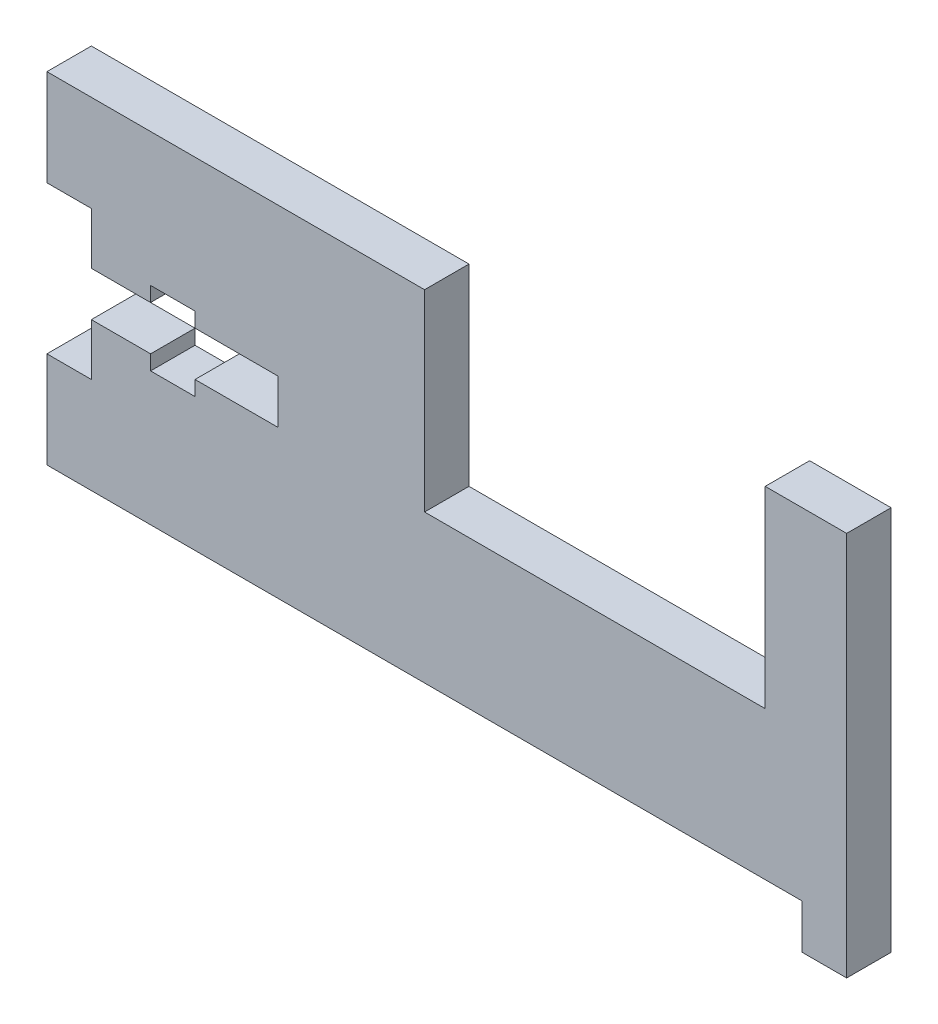
ISO-10303-21;
HEADER;
FILE_DESCRIPTION(('STEP AP214'),'2;1');
FILE_NAME('part.step','',(''),(''),'','','');
FILE_SCHEMA(('AUTOMOTIVE_DESIGN { 1 0 10303 214 1 1 1 1 }'));
ENDSEC;
DATA;
#1=APPLICATION_CONTEXT('core data for automotive mechanical design processes');
#2=APPLICATION_PROTOCOL_DEFINITION('international standard','automotive_design',2000,#1);
#3=PRODUCT_CONTEXT('',#1,'mechanical');
#4=PRODUCT('Part','Part','',(#3));
#5=PRODUCT_RELATED_PRODUCT_CATEGORY('part','',(#4));
#6=PRODUCT_DEFINITION_FORMATION('','',#4);
#7=PRODUCT_DEFINITION_CONTEXT('part definition',#1,'design');
#8=PRODUCT_DEFINITION('design','',#6,#7);
#9=PRODUCT_DEFINITION_SHAPE('','',#8);
#10=(LENGTH_UNIT() NAMED_UNIT(*) SI_UNIT(.MILLI.,.METRE.));
#11=(NAMED_UNIT(*) PLANE_ANGLE_UNIT() SI_UNIT($,.RADIAN.));
#12=(NAMED_UNIT(*) SI_UNIT($,.STERADIAN.) SOLID_ANGLE_UNIT());
#13=UNCERTAINTY_MEASURE_WITH_UNIT(LENGTH_MEASURE(1.E-05),#10,'distance_accuracy_value','');
#14=(GEOMETRIC_REPRESENTATION_CONTEXT(3) GLOBAL_UNCERTAINTY_ASSIGNED_CONTEXT((#13)) GLOBAL_UNIT_ASSIGNED_CONTEXT((#10,
#11,#12)) REPRESENTATION_CONTEXT('',''));
#15=CARTESIAN_POINT('',(0.,0.,0.));
#16=DIRECTION('',(0.,0.,1.));
#17=DIRECTION('',(1.,0.,0.));
#18=AXIS2_PLACEMENT_3D('',#15,#16,#17);
#19=CARTESIAN_POINT('',(-5.49999999999999,0.,3.));
#20=DIRECTION('',(0.,-1.,0.));
#21=DIRECTION('',(0.,0.,-1.));
#22=AXIS2_PLACEMENT_3D('',#19,#20,#21);
#23=PLANE('',#22);
#24=DIRECTION('',(-1.,0.,0.));
#25=VECTOR('',#24,1.);
#26=CARTESIAN_POINT('',(-5.49999999999999,0.,0.));
#27=LINE('',#26,#25);
#28=CARTESIAN_POINT('',(0.,0.,0.));
#29=VERTEX_POINT('',#28);
#30=CARTESIAN_POINT('',(-5.49999999999999,0.,0.));
#31=VERTEX_POINT('',#30);
#32=EDGE_CURVE('E243',#29,#31,#27,.T.);
#33=ORIENTED_EDGE('',*,*,#32,.T.);
#34=DIRECTION('',(0.,0.,-1.));
#35=VECTOR('',#34,1.);
#36=CARTESIAN_POINT('',(-5.49999999999999,0.,3.));
#37=LINE('',#36,#35);
#38=CARTESIAN_POINT('',(-5.49999999999999,0.,3.));
#39=VERTEX_POINT('',#38);
#40=EDGE_CURVE('E11',#39,#31,#37,.T.);
#41=ORIENTED_EDGE('',*,*,#40,.F.);
#42=DIRECTION('',(-1.,0.,0.));
#43=VECTOR('',#42,1.);
#44=CARTESIAN_POINT('',(-5.49999999999999,0.,3.));
#45=LINE('',#44,#43);
#46=CARTESIAN_POINT('',(0.,0.,3.));
#47=VERTEX_POINT('',#46);
#48=EDGE_CURVE('E293',#47,#39,#45,.T.);
#49=ORIENTED_EDGE('',*,*,#48,.F.);
#50=DIRECTION('',(0.,0.,-1.));
#51=VECTOR('',#50,1.);
#52=CARTESIAN_POINT('',(0.,0.,3.));
#53=LINE('',#52,#51);
#54=EDGE_CURVE('E239',#47,#29,#53,.T.);
#55=ORIENTED_EDGE('',*,*,#54,.T.);
#56=EDGE_LOOP('',(#33,#41,#49,#55));
#57=FACE_BOUND('',#56,.T.);
#58=ADVANCED_FACE('F39',(#57),#23,.F.);
#59=CARTESIAN_POINT('',(-5.49999999999999,-13.,3.));
#60=DIRECTION('',(1.,0.,0.));
#61=DIRECTION('',(0.,0.,-1.));
#62=AXIS2_PLACEMENT_3D('',#59,#60,#61);
#63=PLANE('',#62);
#64=DIRECTION('',(0.,-1.,0.));
#65=VECTOR('',#64,1.);
#66=CARTESIAN_POINT('',(-5.49999999999999,-13.,0.));
#67=LINE('',#66,#65);
#68=CARTESIAN_POINT('',(-5.49999999999999,-13.,0.));
#69=VERTEX_POINT('',#68);
#70=EDGE_CURVE('E246',#31,#69,#67,.T.);
#71=ORIENTED_EDGE('',*,*,#70,.T.);
#72=DIRECTION('',(0.,0.,-1.));
#73=VECTOR('',#72,1.);
#74=CARTESIAN_POINT('',(-5.49999999999999,-13.,3.));
#75=LINE('',#74,#73);
#76=CARTESIAN_POINT('',(-5.49999999999999,-13.,3.));
#77=VERTEX_POINT('',#76);
#78=EDGE_CURVE('E47',#77,#69,#75,.T.);
#79=ORIENTED_EDGE('',*,*,#78,.F.);
#80=DIRECTION('',(0.,-1.,0.));
#81=VECTOR('',#80,1.);
#82=CARTESIAN_POINT('',(-5.49999999999999,-13.,3.));
#83=LINE('',#82,#81);
#84=EDGE_CURVE('E152',#39,#77,#83,.T.);
#85=ORIENTED_EDGE('',*,*,#84,.F.);
#86=ORIENTED_EDGE('',*,*,#40,.T.);
#87=EDGE_LOOP('',(#71,#79,#85,#86));
#88=FACE_BOUND('',#87,.T.);
#89=ADVANCED_FACE('F441',(#88),#63,.F.);
#90=CARTESIAN_POINT('',(-28.5,-13.,3.));
#91=DIRECTION('',(0.,-1.,0.));
#92=DIRECTION('',(0.,0.,-1.));
#93=AXIS2_PLACEMENT_3D('',#90,#91,#92);
#94=PLANE('',#93);
#95=DIRECTION('',(-1.,0.,0.));
#96=VECTOR('',#95,1.);
#97=CARTESIAN_POINT('',(-28.5,-13.,0.));
#98=LINE('',#97,#96);
#99=CARTESIAN_POINT('',(-28.5,-13.,0.));
#100=VERTEX_POINT('',#99);
#101=EDGE_CURVE('E248',#69,#100,#98,.T.);
#102=ORIENTED_EDGE('',*,*,#101,.T.);
#103=DIRECTION('',(0.,0.,-1.));
#104=VECTOR('',#103,1.);
#105=CARTESIAN_POINT('',(-28.5,-13.,3.));
#106=LINE('',#105,#104);
#107=CARTESIAN_POINT('',(-28.5,-13.,3.));
#108=VERTEX_POINT('',#107);
#109=EDGE_CURVE('E354',#108,#100,#106,.T.);
#110=ORIENTED_EDGE('',*,*,#109,.F.);
#111=DIRECTION('',(-1.,0.,0.));
#112=VECTOR('',#111,1.);
#113=CARTESIAN_POINT('',(-28.5,-13.,3.));
#114=LINE('',#113,#112);
#115=EDGE_CURVE('E362',#77,#108,#114,.T.);
#116=ORIENTED_EDGE('',*,*,#115,.F.);
#117=ORIENTED_EDGE('',*,*,#78,.T.);
#118=EDGE_LOOP('',(#102,#110,#116,#117));
#119=FACE_BOUND('',#118,.T.);
#120=ADVANCED_FACE('F360',(#119),#94,.F.);
#121=CARTESIAN_POINT('',(-28.5,0.,3.));
#122=DIRECTION('',(-1.,0.,0.));
#123=DIRECTION('',(0.,0.,1.));
#124=AXIS2_PLACEMENT_3D('',#121,#122,#123);
#125=PLANE('',#124);
#126=DIRECTION('',(0.,1.,0.));
#127=VECTOR('',#126,1.);
#128=CARTESIAN_POINT('',(-28.5,0.,0.));
#129=LINE('',#128,#127);
#130=CARTESIAN_POINT('',(-28.5,0.,0.));
#131=VERTEX_POINT('',#130);
#132=EDGE_CURVE('E250',#100,#131,#129,.T.);
#133=ORIENTED_EDGE('',*,*,#132,.T.);
#134=DIRECTION('',(0.,0.,-1.));
#135=VECTOR('',#134,1.);
#136=CARTESIAN_POINT('',(-28.5,0.,3.));
#137=LINE('',#136,#135);
#138=CARTESIAN_POINT('',(-28.5,0.,3.));
#139=VERTEX_POINT('',#138);
#140=EDGE_CURVE('E351',#139,#131,#137,.T.);
#141=ORIENTED_EDGE('',*,*,#140,.F.);
#142=DIRECTION('',(0.,1.,0.));
#143=VECTOR('',#142,1.);
#144=CARTESIAN_POINT('',(-28.5,0.,3.));
#145=LINE('',#144,#143);
#146=EDGE_CURVE('E380',#108,#139,#145,.T.);
#147=ORIENTED_EDGE('',*,*,#146,.F.);
#148=ORIENTED_EDGE('',*,*,#109,.T.);
#149=EDGE_LOOP('',(#133,#141,#147,#148));
#150=FACE_BOUND('',#149,.T.);
#151=ADVANCED_FACE('F371',(#150),#125,.F.);
#152=CARTESIAN_POINT('',(-54.,0.,3.));
#153=DIRECTION('',(0.,-1.,0.));
#154=DIRECTION('',(0.,0.,-1.));
#155=AXIS2_PLACEMENT_3D('',#152,#153,#154);
#156=PLANE('',#155);
#157=DIRECTION('',(-1.,0.,0.));
#158=VECTOR('',#157,1.);
#159=CARTESIAN_POINT('',(-54.,0.,0.));
#160=LINE('',#159,#158);
#161=CARTESIAN_POINT('',(-54.,0.,0.));
#162=VERTEX_POINT('',#161);
#163=EDGE_CURVE('E252',#131,#162,#160,.T.);
#164=ORIENTED_EDGE('',*,*,#163,.T.);
#165=DIRECTION('',(0.,0.,-1.));
#166=VECTOR('',#165,1.);
#167=CARTESIAN_POINT('',(-54.,0.,3.));
#168=LINE('',#167,#166);
#169=CARTESIAN_POINT('',(-54.,0.,3.));
#170=VERTEX_POINT('',#169);
#171=EDGE_CURVE('E348',#170,#162,#168,.T.);
#172=ORIENTED_EDGE('',*,*,#171,.F.);
#173=DIRECTION('',(-1.,0.,0.));
#174=VECTOR('',#173,1.);
#175=CARTESIAN_POINT('',(-54.,0.,3.));
#176=LINE('',#175,#174);
#177=EDGE_CURVE('E377',#139,#170,#176,.T.);
#178=ORIENTED_EDGE('',*,*,#177,.F.);
#179=ORIENTED_EDGE('',*,*,#140,.T.);
#180=EDGE_LOOP('',(#164,#172,#178,#179));
#181=FACE_BOUND('',#180,.T.);
#182=ADVANCED_FACE('F375',(#181),#156,.F.);
#183=CARTESIAN_POINT('',(-54.,-6.5,3.));
#184=DIRECTION('',(1.,0.,0.));
#185=DIRECTION('',(0.,0.,-1.));
#186=AXIS2_PLACEMENT_3D('',#183,#184,#185);
#187=PLANE('',#186);
#188=DIRECTION('',(0.,-1.,0.));
#189=VECTOR('',#188,1.);
#190=CARTESIAN_POINT('',(-54.,-6.5,0.));
#191=LINE('',#190,#189);
#192=CARTESIAN_POINT('',(-54.,-6.5,0.));
#193=VERTEX_POINT('',#192);
#194=EDGE_CURVE('E254',#162,#193,#191,.T.);
#195=ORIENTED_EDGE('',*,*,#194,.T.);
#196=DIRECTION('',(0.,0.,-1.));
#197=VECTOR('',#196,1.);
#198=CARTESIAN_POINT('',(-54.,-6.5,3.));
#199=LINE('',#198,#197);
#200=CARTESIAN_POINT('',(-54.,-6.5,3.));
#201=VERTEX_POINT('',#200);
#202=EDGE_CURVE('E345',#201,#193,#199,.T.);
#203=ORIENTED_EDGE('',*,*,#202,.F.);
#204=DIRECTION('',(0.,-1.,0.));
#205=VECTOR('',#204,1.);
#206=CARTESIAN_POINT('',(-54.,-6.5,3.));
#207=LINE('',#206,#205);
#208=EDGE_CURVE('E379',#170,#201,#207,.T.);
#209=ORIENTED_EDGE('',*,*,#208,.F.);
#210=ORIENTED_EDGE('',*,*,#171,.T.);
#211=EDGE_LOOP('',(#195,#203,#209,#210));
#212=FACE_BOUND('',#211,.T.);
#213=ADVANCED_FACE('F454',(#212),#187,.F.);
#214=CARTESIAN_POINT('',(-51.,-6.5,3.));
#215=DIRECTION('',(0.,1.,0.));
#216=DIRECTION('',(0.,0.,1.));
#217=AXIS2_PLACEMENT_3D('',#214,#215,#216);
#218=PLANE('',#217);
#219=DIRECTION('',(1.,0.,0.));
#220=VECTOR('',#219,1.);
#221=CARTESIAN_POINT('',(-51.,-6.5,0.));
#222=LINE('',#221,#220);
#223=CARTESIAN_POINT('',(-51.,-6.5,0.));
#224=VERTEX_POINT('',#223);
#225=EDGE_CURVE('E256',#193,#224,#222,.T.);
#226=ORIENTED_EDGE('',*,*,#225,.T.);
#227=DIRECTION('',(0.,0.,-1.));
#228=VECTOR('',#227,1.);
#229=CARTESIAN_POINT('',(-51.,-6.5,3.));
#230=LINE('',#229,#228);
#231=CARTESIAN_POINT('',(-51.,-6.5,3.));
#232=VERTEX_POINT('',#231);
#233=EDGE_CURVE('E342',#232,#224,#230,.T.);
#234=ORIENTED_EDGE('',*,*,#233,.F.);
#235=DIRECTION('',(1.,0.,0.));
#236=VECTOR('',#235,1.);
#237=CARTESIAN_POINT('',(-51.,-6.5,3.));
#238=LINE('',#237,#236);
#239=EDGE_CURVE('E382',#201,#232,#238,.T.);
#240=ORIENTED_EDGE('',*,*,#239,.F.);
#241=ORIENTED_EDGE('',*,*,#202,.T.);
#242=EDGE_LOOP('',(#226,#234,#240,#241));
#243=FACE_BOUND('',#242,.T.);
#244=ADVANCED_FACE('F457',(#243),#218,.F.);
#245=CARTESIAN_POINT('',(-51.,-9.99999999999999,3.));
#246=DIRECTION('',(1.,0.,0.));
#247=DIRECTION('',(0.,0.,-1.));
#248=AXIS2_PLACEMENT_3D('',#245,#246,#247);
#249=PLANE('',#248);
#250=DIRECTION('',(0.,-1.,0.));
#251=VECTOR('',#250,1.);
#252=CARTESIAN_POINT('',(-51.,-9.99999999999999,0.));
#253=LINE('',#252,#251);
#254=CARTESIAN_POINT('',(-51.,-9.99999999999999,0.));
#255=VERTEX_POINT('',#254);
#256=EDGE_CURVE('E258',#224,#255,#253,.T.);
#257=ORIENTED_EDGE('',*,*,#256,.T.);
#258=DIRECTION('',(0.,0.,-1.));
#259=VECTOR('',#258,1.);
#260=CARTESIAN_POINT('',(-51.,-9.99999999999999,3.));
#261=LINE('',#260,#259);
#262=CARTESIAN_POINT('',(-51.,-9.99999999999999,3.));
#263=VERTEX_POINT('',#262);
#264=EDGE_CURVE('E339',#263,#255,#261,.T.);
#265=ORIENTED_EDGE('',*,*,#264,.F.);
#266=DIRECTION('',(0.,-1.,0.));
#267=VECTOR('',#266,1.);
#268=CARTESIAN_POINT('',(-51.,-9.99999999999999,3.));
#269=LINE('',#268,#267);
#270=EDGE_CURVE('E388',#232,#263,#269,.T.);
#271=ORIENTED_EDGE('',*,*,#270,.F.);
#272=ORIENTED_EDGE('',*,*,#233,.T.);
#273=EDGE_LOOP('',(#257,#265,#271,#272));
#274=FACE_BOUND('',#273,.T.);
#275=ADVANCED_FACE('F461',(#274),#249,.F.);
#276=CARTESIAN_POINT('',(-47.,-9.99999999999999,3.));
#277=DIRECTION('',(0.,1.,0.));
#278=DIRECTION('',(0.,0.,1.));
#279=AXIS2_PLACEMENT_3D('',#276,#277,#278);
#280=PLANE('',#279);
#281=DIRECTION('',(1.,0.,0.));
#282=VECTOR('',#281,1.);
#283=CARTESIAN_POINT('',(-47.,-9.99999999999999,0.));
#284=LINE('',#283,#282);
#285=CARTESIAN_POINT('',(-47.,-9.99999999999999,0.));
#286=VERTEX_POINT('',#285);
#287=EDGE_CURVE('E260',#255,#286,#284,.T.);
#288=ORIENTED_EDGE('',*,*,#287,.T.);
#289=DIRECTION('',(0.,0.,-1.));
#290=VECTOR('',#289,1.);
#291=CARTESIAN_POINT('',(-47.,-9.99999999999999,3.));
#292=LINE('',#291,#290);
#293=CARTESIAN_POINT('',(-47.,-9.99999999999999,3.));
#294=VERTEX_POINT('',#293);
#295=EDGE_CURVE('E336',#294,#286,#292,.T.);
#296=ORIENTED_EDGE('',*,*,#295,.F.);
#297=DIRECTION('',(1.,0.,0.));
#298=VECTOR('',#297,1.);
#299=CARTESIAN_POINT('',(-47.,-9.99999999999999,3.));
#300=LINE('',#299,#298);
#301=EDGE_CURVE('E390',#263,#294,#300,.T.);
#302=ORIENTED_EDGE('',*,*,#301,.F.);
#303=ORIENTED_EDGE('',*,*,#264,.T.);
#304=EDGE_LOOP('',(#288,#296,#302,#303));
#305=FACE_BOUND('',#304,.T.);
#306=ADVANCED_FACE('F465',(#305),#280,.F.);
#307=CARTESIAN_POINT('',(-47.,-8.99999999999999,3.));
#308=DIRECTION('',(-1.,0.,0.));
#309=DIRECTION('',(0.,0.,1.));
#310=AXIS2_PLACEMENT_3D('',#307,#308,#309);
#311=PLANE('',#310);
#312=DIRECTION('',(0.,1.,0.));
#313=VECTOR('',#312,1.);
#314=CARTESIAN_POINT('',(-47.,-8.99999999999999,0.));
#315=LINE('',#314,#313);
#316=CARTESIAN_POINT('',(-47.,-8.99999999999999,0.));
#317=VERTEX_POINT('',#316);
#318=EDGE_CURVE('E262',#286,#317,#315,.T.);
#319=ORIENTED_EDGE('',*,*,#318,.T.);
#320=DIRECTION('',(0.,0.,-1.));
#321=VECTOR('',#320,1.);
#322=CARTESIAN_POINT('',(-47.,-8.99999999999999,3.));
#323=LINE('',#322,#321);
#324=CARTESIAN_POINT('',(-47.,-8.99999999999999,3.));
#325=VERTEX_POINT('',#324);
#326=EDGE_CURVE('E333',#325,#317,#323,.T.);
#327=ORIENTED_EDGE('',*,*,#326,.F.);
#328=DIRECTION('',(0.,1.,0.));
#329=VECTOR('',#328,1.);
#330=CARTESIAN_POINT('',(-47.,-8.99999999999999,3.));
#331=LINE('',#330,#329);
#332=EDGE_CURVE('E392',#294,#325,#331,.T.);
#333=ORIENTED_EDGE('',*,*,#332,.F.);
#334=ORIENTED_EDGE('',*,*,#295,.T.);
#335=EDGE_LOOP('',(#319,#327,#333,#334));
#336=FACE_BOUND('',#335,.T.);
#337=ADVANCED_FACE('F469',(#336),#311,.F.);
#338=CARTESIAN_POINT('',(-44.,-8.99999999999999,3.));
#339=DIRECTION('',(0.,1.,0.));
#340=DIRECTION('',(0.,0.,1.));
#341=AXIS2_PLACEMENT_3D('',#338,#339,#340);
#342=PLANE('',#341);
#343=DIRECTION('',(1.,0.,0.));
#344=VECTOR('',#343,1.);
#345=CARTESIAN_POINT('',(-44.,-8.99999999999999,0.));
#346=LINE('',#345,#344);
#347=CARTESIAN_POINT('',(-44.,-8.99999999999999,0.));
#348=VERTEX_POINT('',#347);
#349=EDGE_CURVE('E264',#317,#348,#346,.T.);
#350=ORIENTED_EDGE('',*,*,#349,.T.);
#351=DIRECTION('',(0.,0.,-1.));
#352=VECTOR('',#351,1.);
#353=CARTESIAN_POINT('',(-44.,-8.99999999999999,3.));
#354=LINE('',#353,#352);
#355=CARTESIAN_POINT('',(-44.,-8.99999999999999,3.));
#356=VERTEX_POINT('',#355);
#357=EDGE_CURVE('E330',#356,#348,#354,.T.);
#358=ORIENTED_EDGE('',*,*,#357,.F.);
#359=DIRECTION('',(1.,0.,0.));
#360=VECTOR('',#359,1.);
#361=CARTESIAN_POINT('',(-44.,-8.99999999999999,3.));
#362=LINE('',#361,#360);
#363=EDGE_CURVE('E394',#325,#356,#362,.T.);
#364=ORIENTED_EDGE('',*,*,#363,.F.);
#365=ORIENTED_EDGE('',*,*,#326,.T.);
#366=EDGE_LOOP('',(#350,#358,#364,#365));
#367=FACE_BOUND('',#366,.T.);
#368=ADVANCED_FACE('F473',(#367),#342,.F.);
#369=CARTESIAN_POINT('',(-44.,-9.99999999999999,3.));
#370=DIRECTION('',(1.,0.,0.));
#371=DIRECTION('',(0.,0.,-1.));
#372=AXIS2_PLACEMENT_3D('',#369,#370,#371);
#373=PLANE('',#372);
#374=DIRECTION('',(0.,-1.,0.));
#375=VECTOR('',#374,1.);
#376=CARTESIAN_POINT('',(-44.,-9.99999999999999,0.));
#377=LINE('',#376,#375);
#378=CARTESIAN_POINT('',(-44.,-9.99999999999999,0.));
#379=VERTEX_POINT('',#378);
#380=EDGE_CURVE('E266',#348,#379,#377,.T.);
#381=ORIENTED_EDGE('',*,*,#380,.T.);
#382=DIRECTION('',(0.,0.,-1.));
#383=VECTOR('',#382,1.);
#384=CARTESIAN_POINT('',(-44.,-9.99999999999999,3.));
#385=LINE('',#384,#383);
#386=CARTESIAN_POINT('',(-44.,-9.99999999999999,3.));
#387=VERTEX_POINT('',#386);
#388=EDGE_CURVE('E327',#387,#379,#385,.T.);
#389=ORIENTED_EDGE('',*,*,#388,.F.);
#390=DIRECTION('',(0.,-1.,0.));
#391=VECTOR('',#390,1.);
#392=CARTESIAN_POINT('',(-44.,-9.99999999999999,3.));
#393=LINE('',#392,#391);
#394=EDGE_CURVE('E396',#356,#387,#393,.T.);
#395=ORIENTED_EDGE('',*,*,#394,.F.);
#396=ORIENTED_EDGE('',*,*,#357,.T.);
#397=EDGE_LOOP('',(#381,#389,#395,#396));
#398=FACE_BOUND('',#397,.T.);
#399=ADVANCED_FACE('F477',(#398),#373,.F.);
#400=CARTESIAN_POINT('',(-38.4,-9.99999999999999,3.));
#401=DIRECTION('',(0.,1.,0.));
#402=DIRECTION('',(0.,0.,1.));
#403=AXIS2_PLACEMENT_3D('',#400,#401,#402);
#404=PLANE('',#403);
#405=DIRECTION('',(1.,0.,0.));
#406=VECTOR('',#405,1.);
#407=CARTESIAN_POINT('',(-38.4,-9.99999999999999,0.));
#408=LINE('',#407,#406);
#409=CARTESIAN_POINT('',(-38.4,-9.99999999999999,0.));
#410=VERTEX_POINT('',#409);
#411=EDGE_CURVE('E268',#379,#410,#408,.T.);
#412=ORIENTED_EDGE('',*,*,#411,.T.);
#413=DIRECTION('',(0.,0.,-1.));
#414=VECTOR('',#413,1.);
#415=CARTESIAN_POINT('',(-38.4,-9.99999999999999,3.));
#416=LINE('',#415,#414);
#417=CARTESIAN_POINT('',(-38.4,-9.99999999999999,3.));
#418=VERTEX_POINT('',#417);
#419=EDGE_CURVE('E324',#418,#410,#416,.T.);
#420=ORIENTED_EDGE('',*,*,#419,.F.);
#421=DIRECTION('',(1.,0.,0.));
#422=VECTOR('',#421,1.);
#423=CARTESIAN_POINT('',(-38.4,-9.99999999999999,3.));
#424=LINE('',#423,#422);
#425=EDGE_CURVE('E398',#387,#418,#424,.T.);
#426=ORIENTED_EDGE('',*,*,#425,.F.);
#427=ORIENTED_EDGE('',*,*,#388,.T.);
#428=EDGE_LOOP('',(#412,#420,#426,#427));
#429=FACE_BOUND('',#428,.T.);
#430=ADVANCED_FACE('F481',(#429),#404,.F.);
#431=CARTESIAN_POINT('',(-38.4,-13.,3.));
#432=DIRECTION('',(1.,0.,0.));
#433=DIRECTION('',(0.,0.,-1.));
#434=AXIS2_PLACEMENT_3D('',#431,#432,#433);
#435=PLANE('',#434);
#436=DIRECTION('',(0.,-1.,0.));
#437=VECTOR('',#436,1.);
#438=CARTESIAN_POINT('',(-38.4,-13.,0.));
#439=LINE('',#438,#437);
#440=CARTESIAN_POINT('',(-38.4,-13.,0.));
#441=VERTEX_POINT('',#440);
#442=EDGE_CURVE('E270',#410,#441,#439,.T.);
#443=ORIENTED_EDGE('',*,*,#442,.T.);
#444=DIRECTION('',(0.,0.,-1.));
#445=VECTOR('',#444,1.);
#446=CARTESIAN_POINT('',(-38.4,-13.,3.));
#447=LINE('',#446,#445);
#448=CARTESIAN_POINT('',(-38.4,-13.,3.));
#449=VERTEX_POINT('',#448);
#450=EDGE_CURVE('E321',#449,#441,#447,.T.);
#451=ORIENTED_EDGE('',*,*,#450,.F.);
#452=DIRECTION('',(0.,-1.,0.));
#453=VECTOR('',#452,1.);
#454=CARTESIAN_POINT('',(-38.4,-13.,3.));
#455=LINE('',#454,#453);
#456=EDGE_CURVE('E400',#418,#449,#455,.T.);
#457=ORIENTED_EDGE('',*,*,#456,.F.);
#458=ORIENTED_EDGE('',*,*,#419,.T.);
#459=EDGE_LOOP('',(#443,#451,#457,#458));
#460=FACE_BOUND('',#459,.T.);
#461=ADVANCED_FACE('F485',(#460),#435,.F.);
#462=CARTESIAN_POINT('',(-44.,-13.,3.));
#463=DIRECTION('',(0.,-1.,0.));
#464=DIRECTION('',(0.,0.,-1.));
#465=AXIS2_PLACEMENT_3D('',#462,#463,#464);
#466=PLANE('',#465);
#467=DIRECTION('',(-1.,0.,0.));
#468=VECTOR('',#467,1.);
#469=CARTESIAN_POINT('',(-44.,-13.,0.));
#470=LINE('',#469,#468);
#471=CARTESIAN_POINT('',(-44.,-13.,0.));
#472=VERTEX_POINT('',#471);
#473=EDGE_CURVE('E272',#441,#472,#470,.T.);
#474=ORIENTED_EDGE('',*,*,#473,.T.);
#475=DIRECTION('',(0.,0.,-1.));
#476=VECTOR('',#475,1.);
#477=CARTESIAN_POINT('',(-44.,-13.,3.));
#478=LINE('',#477,#476);
#479=CARTESIAN_POINT('',(-44.,-13.,3.));
#480=VERTEX_POINT('',#479);
#481=EDGE_CURVE('E318',#480,#472,#478,.T.);
#482=ORIENTED_EDGE('',*,*,#481,.F.);
#483=DIRECTION('',(-1.,0.,0.));
#484=VECTOR('',#483,1.);
#485=CARTESIAN_POINT('',(-44.,-13.,3.));
#486=LINE('',#485,#484);
#487=EDGE_CURVE('E402',#449,#480,#486,.T.);
#488=ORIENTED_EDGE('',*,*,#487,.F.);
#489=ORIENTED_EDGE('',*,*,#450,.T.);
#490=EDGE_LOOP('',(#474,#482,#488,#489));
#491=FACE_BOUND('',#490,.T.);
#492=ADVANCED_FACE('F489',(#491),#466,.F.);
#493=CARTESIAN_POINT('',(-44.,-14.,3.));
#494=DIRECTION('',(1.,0.,0.));
#495=DIRECTION('',(0.,0.,-1.));
#496=AXIS2_PLACEMENT_3D('',#493,#494,#495);
#497=PLANE('',#496);
#498=DIRECTION('',(0.,-1.,0.));
#499=VECTOR('',#498,1.);
#500=CARTESIAN_POINT('',(-44.,-14.,0.));
#501=LINE('',#500,#499);
#502=CARTESIAN_POINT('',(-44.,-14.,0.));
#503=VERTEX_POINT('',#502);
#504=EDGE_CURVE('E274',#472,#503,#501,.T.);
#505=ORIENTED_EDGE('',*,*,#504,.T.);
#506=DIRECTION('',(0.,0.,-1.));
#507=VECTOR('',#506,1.);
#508=CARTESIAN_POINT('',(-44.,-14.,3.));
#509=LINE('',#508,#507);
#510=CARTESIAN_POINT('',(-44.,-14.,3.));
#511=VERTEX_POINT('',#510);
#512=EDGE_CURVE('E315',#511,#503,#509,.T.);
#513=ORIENTED_EDGE('',*,*,#512,.F.);
#514=DIRECTION('',(0.,-1.,0.));
#515=VECTOR('',#514,1.);
#516=CARTESIAN_POINT('',(-44.,-14.,3.));
#517=LINE('',#516,#515);
#518=EDGE_CURVE('E404',#480,#511,#517,.T.);
#519=ORIENTED_EDGE('',*,*,#518,.F.);
#520=ORIENTED_EDGE('',*,*,#481,.T.);
#521=EDGE_LOOP('',(#505,#513,#519,#520));
#522=FACE_BOUND('',#521,.T.);
#523=ADVANCED_FACE('F493',(#522),#497,.F.);
#524=CARTESIAN_POINT('',(-47.,-14.,3.));
#525=DIRECTION('',(0.,-1.,0.));
#526=DIRECTION('',(0.,0.,-1.));
#527=AXIS2_PLACEMENT_3D('',#524,#525,#526);
#528=PLANE('',#527);
#529=DIRECTION('',(-1.,0.,0.));
#530=VECTOR('',#529,1.);
#531=CARTESIAN_POINT('',(-47.,-14.,0.));
#532=LINE('',#531,#530);
#533=CARTESIAN_POINT('',(-47.,-14.,0.));
#534=VERTEX_POINT('',#533);
#535=EDGE_CURVE('E276',#503,#534,#532,.T.);
#536=ORIENTED_EDGE('',*,*,#535,.T.);
#537=DIRECTION('',(0.,0.,-1.));
#538=VECTOR('',#537,1.);
#539=CARTESIAN_POINT('',(-47.,-14.,3.));
#540=LINE('',#539,#538);
#541=CARTESIAN_POINT('',(-47.,-14.,3.));
#542=VERTEX_POINT('',#541);
#543=EDGE_CURVE('E312',#542,#534,#540,.T.);
#544=ORIENTED_EDGE('',*,*,#543,.F.);
#545=DIRECTION('',(-1.,0.,0.));
#546=VECTOR('',#545,1.);
#547=CARTESIAN_POINT('',(-47.,-14.,3.));
#548=LINE('',#547,#546);
#549=EDGE_CURVE('E406',#511,#542,#548,.T.);
#550=ORIENTED_EDGE('',*,*,#549,.F.);
#551=ORIENTED_EDGE('',*,*,#512,.T.);
#552=EDGE_LOOP('',(#536,#544,#550,#551));
#553=FACE_BOUND('',#552,.T.);
#554=ADVANCED_FACE('F497',(#553),#528,.F.);
#555=CARTESIAN_POINT('',(-47.,-13.,3.));
#556=DIRECTION('',(-1.,0.,0.));
#557=DIRECTION('',(0.,0.,1.));
#558=AXIS2_PLACEMENT_3D('',#555,#556,#557);
#559=PLANE('',#558);
#560=DIRECTION('',(0.,1.,0.));
#561=VECTOR('',#560,1.);
#562=CARTESIAN_POINT('',(-47.,-13.,0.));
#563=LINE('',#562,#561);
#564=CARTESIAN_POINT('',(-47.,-13.,0.));
#565=VERTEX_POINT('',#564);
#566=EDGE_CURVE('E278',#534,#565,#563,.T.);
#567=ORIENTED_EDGE('',*,*,#566,.T.);
#568=DIRECTION('',(0.,0.,-1.));
#569=VECTOR('',#568,1.);
#570=CARTESIAN_POINT('',(-47.,-13.,3.));
#571=LINE('',#570,#569);
#572=CARTESIAN_POINT('',(-47.,-13.,3.));
#573=VERTEX_POINT('',#572);
#574=EDGE_CURVE('E309',#573,#565,#571,.T.);
#575=ORIENTED_EDGE('',*,*,#574,.F.);
#576=DIRECTION('',(0.,1.,0.));
#577=VECTOR('',#576,1.);
#578=CARTESIAN_POINT('',(-47.,-13.,3.));
#579=LINE('',#578,#577);
#580=EDGE_CURVE('E408',#542,#573,#579,.T.);
#581=ORIENTED_EDGE('',*,*,#580,.F.);
#582=ORIENTED_EDGE('',*,*,#543,.T.);
#583=EDGE_LOOP('',(#567,#575,#581,#582));
#584=FACE_BOUND('',#583,.T.);
#585=ADVANCED_FACE('F501',(#584),#559,.F.);
#586=CARTESIAN_POINT('',(-51.,-13.,3.));
#587=DIRECTION('',(0.,-1.,0.));
#588=DIRECTION('',(0.,0.,-1.));
#589=AXIS2_PLACEMENT_3D('',#586,#587,#588);
#590=PLANE('',#589);
#591=DIRECTION('',(-1.,0.,0.));
#592=VECTOR('',#591,1.);
#593=CARTESIAN_POINT('',(-51.,-13.,0.));
#594=LINE('',#593,#592);
#595=CARTESIAN_POINT('',(-51.,-13.,0.));
#596=VERTEX_POINT('',#595);
#597=EDGE_CURVE('E280',#565,#596,#594,.T.);
#598=ORIENTED_EDGE('',*,*,#597,.T.);
#599=DIRECTION('',(0.,0.,-1.));
#600=VECTOR('',#599,1.);
#601=CARTESIAN_POINT('',(-51.,-13.,3.));
#602=LINE('',#601,#600);
#603=CARTESIAN_POINT('',(-51.,-13.,3.));
#604=VERTEX_POINT('',#603);
#605=EDGE_CURVE('E306',#604,#596,#602,.T.);
#606=ORIENTED_EDGE('',*,*,#605,.F.);
#607=DIRECTION('',(-1.,0.,0.));
#608=VECTOR('',#607,1.);
#609=CARTESIAN_POINT('',(-51.,-13.,3.));
#610=LINE('',#609,#608);
#611=EDGE_CURVE('E410',#573,#604,#610,.T.);
#612=ORIENTED_EDGE('',*,*,#611,.F.);
#613=ORIENTED_EDGE('',*,*,#574,.T.);
#614=EDGE_LOOP('',(#598,#606,#612,#613));
#615=FACE_BOUND('',#614,.T.);
#616=ADVANCED_FACE('F505',(#615),#590,.F.);
#617=CARTESIAN_POINT('',(-51.,-16.5,3.));
#618=DIRECTION('',(1.,0.,0.));
#619=DIRECTION('',(0.,0.,-1.));
#620=AXIS2_PLACEMENT_3D('',#617,#618,#619);
#621=PLANE('',#620);
#622=DIRECTION('',(0.,-1.,0.));
#623=VECTOR('',#622,1.);
#624=CARTESIAN_POINT('',(-51.,-16.5,0.));
#625=LINE('',#624,#623);
#626=CARTESIAN_POINT('',(-51.,-16.5,0.));
#627=VERTEX_POINT('',#626);
#628=EDGE_CURVE('E282',#596,#627,#625,.T.);
#629=ORIENTED_EDGE('',*,*,#628,.T.);
#630=DIRECTION('',(0.,0.,-1.));
#631=VECTOR('',#630,1.);
#632=CARTESIAN_POINT('',(-51.,-16.5,3.));
#633=LINE('',#632,#631);
#634=CARTESIAN_POINT('',(-51.,-16.5,3.));
#635=VERTEX_POINT('',#634);
#636=EDGE_CURVE('E303',#635,#627,#633,.T.);
#637=ORIENTED_EDGE('',*,*,#636,.F.);
#638=DIRECTION('',(0.,-1.,0.));
#639=VECTOR('',#638,1.);
#640=CARTESIAN_POINT('',(-51.,-16.5,3.));
#641=LINE('',#640,#639);
#642=EDGE_CURVE('E412',#604,#635,#641,.T.);
#643=ORIENTED_EDGE('',*,*,#642,.F.);
#644=ORIENTED_EDGE('',*,*,#605,.T.);
#645=EDGE_LOOP('',(#629,#637,#643,#644));
#646=FACE_BOUND('',#645,.T.);
#647=ADVANCED_FACE('F509',(#646),#621,.F.);
#648=CARTESIAN_POINT('',(-54.,-16.5,3.));
#649=DIRECTION('',(0.,-1.,0.));
#650=DIRECTION('',(0.,0.,-1.));
#651=AXIS2_PLACEMENT_3D('',#648,#649,#650);
#652=PLANE('',#651);
#653=DIRECTION('',(-1.,0.,0.));
#654=VECTOR('',#653,1.);
#655=CARTESIAN_POINT('',(-54.,-16.5,0.));
#656=LINE('',#655,#654);
#657=CARTESIAN_POINT('',(-54.,-16.5,0.));
#658=VERTEX_POINT('',#657);
#659=EDGE_CURVE('E284',#627,#658,#656,.T.);
#660=ORIENTED_EDGE('',*,*,#659,.T.);
#661=DIRECTION('',(0.,0.,-1.));
#662=VECTOR('',#661,1.);
#663=CARTESIAN_POINT('',(-54.,-16.5,3.));
#664=LINE('',#663,#662);
#665=CARTESIAN_POINT('',(-54.,-16.5,3.));
#666=VERTEX_POINT('',#665);
#667=EDGE_CURVE('E300',#666,#658,#664,.T.);
#668=ORIENTED_EDGE('',*,*,#667,.F.);
#669=DIRECTION('',(-1.,0.,0.));
#670=VECTOR('',#669,1.);
#671=CARTESIAN_POINT('',(-54.,-16.5,3.));
#672=LINE('',#671,#670);
#673=EDGE_CURVE('E414',#635,#666,#672,.T.);
#674=ORIENTED_EDGE('',*,*,#673,.F.);
#675=ORIENTED_EDGE('',*,*,#636,.T.);
#676=EDGE_LOOP('',(#660,#668,#674,#675));
#677=FACE_BOUND('',#676,.T.);
#678=ADVANCED_FACE('F513',(#677),#652,.F.);
#679=CARTESIAN_POINT('',(-54.,-23.,3.));
#680=DIRECTION('',(1.,0.,0.));
#681=DIRECTION('',(0.,0.,-1.));
#682=AXIS2_PLACEMENT_3D('',#679,#680,#681);
#683=PLANE('',#682);
#684=DIRECTION('',(0.,-1.,0.));
#685=VECTOR('',#684,1.);
#686=CARTESIAN_POINT('',(-54.,-23.,0.));
#687=LINE('',#686,#685);
#688=CARTESIAN_POINT('',(-54.,-23.,0.));
#689=VERTEX_POINT('',#688);
#690=EDGE_CURVE('E286',#658,#689,#687,.T.);
#691=ORIENTED_EDGE('',*,*,#690,.T.);
#692=DIRECTION('',(0.,0.,-1.));
#693=VECTOR('',#692,1.);
#694=CARTESIAN_POINT('',(-54.,-23.,3.));
#695=LINE('',#694,#693);
#696=CARTESIAN_POINT('',(-54.,-23.,3.));
#697=VERTEX_POINT('',#696);
#698=EDGE_CURVE('E297',#697,#689,#695,.T.);
#699=ORIENTED_EDGE('',*,*,#698,.F.);
#700=DIRECTION('',(0.,-1.,0.));
#701=VECTOR('',#700,1.);
#702=CARTESIAN_POINT('',(-54.,-23.,3.));
#703=LINE('',#702,#701);
#704=EDGE_CURVE('E416',#666,#697,#703,.T.);
#705=ORIENTED_EDGE('',*,*,#704,.F.);
#706=ORIENTED_EDGE('',*,*,#667,.T.);
#707=EDGE_LOOP('',(#691,#699,#705,#706));
#708=FACE_BOUND('',#707,.T.);
#709=ADVANCED_FACE('F422',(#708),#683,.F.);
#710=CARTESIAN_POINT('',(-3.,-23.,3.));
#711=DIRECTION('',(0.,1.,0.));
#712=DIRECTION('',(0.,0.,1.));
#713=AXIS2_PLACEMENT_3D('',#710,#711,#712);
#714=PLANE('',#713);
#715=DIRECTION('',(1.,0.,0.));
#716=VECTOR('',#715,1.);
#717=CARTESIAN_POINT('',(-3.,-23.,0.));
#718=LINE('',#717,#716);
#719=CARTESIAN_POINT('',(-3.,-23.,0.));
#720=VERTEX_POINT('',#719);
#721=EDGE_CURVE('E288',#689,#720,#718,.T.);
#722=ORIENTED_EDGE('',*,*,#721,.T.);
#723=DIRECTION('',(0.,0.,-1.));
#724=VECTOR('',#723,1.);
#725=CARTESIAN_POINT('',(-3.,-23.,3.));
#726=LINE('',#725,#724);
#727=CARTESIAN_POINT('',(-3.,-23.,3.));
#728=VERTEX_POINT('',#727);
#729=EDGE_CURVE('E234',#728,#720,#726,.T.);
#730=ORIENTED_EDGE('',*,*,#729,.F.);
#731=DIRECTION('',(1.,0.,0.));
#732=VECTOR('',#731,1.);
#733=CARTESIAN_POINT('',(-3.,-23.,3.));
#734=LINE('',#733,#732);
#735=EDGE_CURVE('E225',#697,#728,#734,.T.);
#736=ORIENTED_EDGE('',*,*,#735,.F.);
#737=ORIENTED_EDGE('',*,*,#698,.T.);
#738=EDGE_LOOP('',(#722,#730,#736,#737));
#739=FACE_BOUND('',#738,.T.);
#740=ADVANCED_FACE('F426',(#739),#714,.F.);
#741=CARTESIAN_POINT('',(-3.,-26.,3.));
#742=DIRECTION('',(1.,0.,0.));
#743=DIRECTION('',(0.,0.,-1.));
#744=AXIS2_PLACEMENT_3D('',#741,#742,#743);
#745=PLANE('',#744);
#746=DIRECTION('',(0.,-1.,0.));
#747=VECTOR('',#746,1.);
#748=CARTESIAN_POINT('',(-3.,-26.,0.));
#749=LINE('',#748,#747);
#750=CARTESIAN_POINT('',(-3.,-26.,0.));
#751=VERTEX_POINT('',#750);
#752=EDGE_CURVE('E233',#720,#751,#749,.T.);
#753=ORIENTED_EDGE('',*,*,#752,.T.);
#754=DIRECTION('',(0.,0.,-1.));
#755=VECTOR('',#754,1.);
#756=CARTESIAN_POINT('',(-3.,-26.,3.));
#757=LINE('',#756,#755);
#758=CARTESIAN_POINT('',(-3.,-26.,3.));
#759=VERTEX_POINT('',#758);
#760=EDGE_CURVE('E230',#759,#751,#757,.T.);
#761=ORIENTED_EDGE('',*,*,#760,.F.);
#762=DIRECTION('',(0.,-1.,0.));
#763=VECTOR('',#762,1.);
#764=CARTESIAN_POINT('',(-3.,-26.,3.));
#765=LINE('',#764,#763);
#766=EDGE_CURVE('E219',#728,#759,#765,.T.);
#767=ORIENTED_EDGE('',*,*,#766,.F.);
#768=ORIENTED_EDGE('',*,*,#729,.T.);
#769=EDGE_LOOP('',(#753,#761,#767,#768));
#770=FACE_BOUND('',#769,.T.);
#771=ADVANCED_FACE('F231',(#770),#745,.F.);
#772=CARTESIAN_POINT('',(0.,-26.,3.));
#773=DIRECTION('',(0.,1.,0.));
#774=DIRECTION('',(0.,0.,1.));
#775=AXIS2_PLACEMENT_3D('',#772,#773,#774);
#776=PLANE('',#775);
#777=DIRECTION('',(1.,0.,0.));
#778=VECTOR('',#777,1.);
#779=CARTESIAN_POINT('',(0.,-26.,0.));
#780=LINE('',#779,#778);
#781=CARTESIAN_POINT('',(0.,-26.,0.));
#782=VERTEX_POINT('',#781);
#783=EDGE_CURVE('E138',#751,#782,#780,.T.);
#784=ORIENTED_EDGE('',*,*,#783,.T.);
#785=DIRECTION('',(0.,0.,-1.));
#786=VECTOR('',#785,1.);
#787=CARTESIAN_POINT('',(0.,-26.,3.));
#788=LINE('',#787,#786);
#789=CARTESIAN_POINT('',(0.,-26.,3.));
#790=VERTEX_POINT('',#789);
#791=EDGE_CURVE('E235',#790,#782,#788,.T.);
#792=ORIENTED_EDGE('',*,*,#791,.F.);
#793=DIRECTION('',(1.,0.,0.));
#794=VECTOR('',#793,1.);
#795=CARTESIAN_POINT('',(0.,-26.,3.));
#796=LINE('',#795,#794);
#797=EDGE_CURVE('E223',#759,#790,#796,.T.);
#798=ORIENTED_EDGE('',*,*,#797,.F.);
#799=ORIENTED_EDGE('',*,*,#760,.T.);
#800=EDGE_LOOP('',(#784,#792,#798,#799));
#801=FACE_BOUND('',#800,.T.);
#802=ADVANCED_FACE('F237',(#801),#776,.F.);
#803=CARTESIAN_POINT('',(0.,0.,3.));
#804=DIRECTION('',(-1.,0.,0.));
#805=DIRECTION('',(0.,0.,1.));
#806=AXIS2_PLACEMENT_3D('',#803,#804,#805);
#807=PLANE('',#806);
#808=DIRECTION('',(0.,1.,0.));
#809=VECTOR('',#808,1.);
#810=CARTESIAN_POINT('',(0.,0.,0.));
#811=LINE('',#810,#809);
#812=EDGE_CURVE('E144',#782,#29,#811,.T.);
#813=ORIENTED_EDGE('',*,*,#812,.T.);
#814=ORIENTED_EDGE('',*,*,#54,.F.);
#815=DIRECTION('',(0.,1.,0.));
#816=VECTOR('',#815,1.);
#817=CARTESIAN_POINT('',(0.,0.,3.));
#818=LINE('',#817,#816);
#819=EDGE_CURVE('E55',#790,#47,#818,.T.);
#820=ORIENTED_EDGE('',*,*,#819,.F.);
#821=ORIENTED_EDGE('',*,*,#791,.T.);
#822=EDGE_LOOP('',(#813,#814,#820,#821));
#823=FACE_BOUND('',#822,.T.);
#824=ADVANCED_FACE('F430',(#823),#807,.F.);
#825=CARTESIAN_POINT('',(0.,0.,3.));
#826=DIRECTION('',(0.,0.,-1.));
#827=DIRECTION('',(-1.,0.,0.));
#828=AXIS2_PLACEMENT_3D('',#825,#826,#827);
#829=PLANE('',#828);
#830=ORIENTED_EDGE('',*,*,#48,.T.);
#831=ORIENTED_EDGE('',*,*,#84,.T.);
#832=ORIENTED_EDGE('',*,*,#115,.T.);
#833=ORIENTED_EDGE('',*,*,#146,.T.);
#834=ORIENTED_EDGE('',*,*,#177,.T.);
#835=ORIENTED_EDGE('',*,*,#208,.T.);
#836=ORIENTED_EDGE('',*,*,#239,.T.);
#837=ORIENTED_EDGE('',*,*,#270,.T.);
#838=ORIENTED_EDGE('',*,*,#301,.T.);
#839=ORIENTED_EDGE('',*,*,#332,.T.);
#840=ORIENTED_EDGE('',*,*,#363,.T.);
#841=ORIENTED_EDGE('',*,*,#394,.T.);
#842=ORIENTED_EDGE('',*,*,#425,.T.);
#843=ORIENTED_EDGE('',*,*,#456,.T.);
#844=ORIENTED_EDGE('',*,*,#487,.T.);
#845=ORIENTED_EDGE('',*,*,#518,.T.);
#846=ORIENTED_EDGE('',*,*,#549,.T.);
#847=ORIENTED_EDGE('',*,*,#580,.T.);
#848=ORIENTED_EDGE('',*,*,#611,.T.);
#849=ORIENTED_EDGE('',*,*,#642,.T.);
#850=ORIENTED_EDGE('',*,*,#673,.T.);
#851=ORIENTED_EDGE('',*,*,#704,.T.);
#852=ORIENTED_EDGE('',*,*,#735,.T.);
#853=ORIENTED_EDGE('',*,*,#766,.T.);
#854=ORIENTED_EDGE('',*,*,#797,.T.);
#855=ORIENTED_EDGE('',*,*,#819,.T.);
#856=EDGE_LOOP('',(#830,#831,#832,#833,#834,#835,#836,#837,#838,#839,#840,#841,#842,#843,#844,
#845,#846,#847,#848,#849,#850,#851,#852,#853,#854,#855));
#857=FACE_BOUND('',#856,.T.);
#858=ADVANCED_FACE('F221',(#857),#829,.F.);
#859=CARTESIAN_POINT('',(0.,0.,0.));
#860=DIRECTION('',(0.,0.,-1.));
#861=DIRECTION('',(-1.,0.,0.));
#862=AXIS2_PLACEMENT_3D('',#859,#860,#861);
#863=PLANE('',#862);
#864=ORIENTED_EDGE('',*,*,#32,.F.);
#865=ORIENTED_EDGE('',*,*,#812,.F.);
#866=ORIENTED_EDGE('',*,*,#783,.F.);
#867=ORIENTED_EDGE('',*,*,#752,.F.);
#868=ORIENTED_EDGE('',*,*,#721,.F.);
#869=ORIENTED_EDGE('',*,*,#690,.F.);
#870=ORIENTED_EDGE('',*,*,#659,.F.);
#871=ORIENTED_EDGE('',*,*,#628,.F.);
#872=ORIENTED_EDGE('',*,*,#597,.F.);
#873=ORIENTED_EDGE('',*,*,#566,.F.);
#874=ORIENTED_EDGE('',*,*,#535,.F.);
#875=ORIENTED_EDGE('',*,*,#504,.F.);
#876=ORIENTED_EDGE('',*,*,#473,.F.);
#877=ORIENTED_EDGE('',*,*,#442,.F.);
#878=ORIENTED_EDGE('',*,*,#411,.F.);
#879=ORIENTED_EDGE('',*,*,#380,.F.);
#880=ORIENTED_EDGE('',*,*,#349,.F.);
#881=ORIENTED_EDGE('',*,*,#318,.F.);
#882=ORIENTED_EDGE('',*,*,#287,.F.);
#883=ORIENTED_EDGE('',*,*,#256,.F.);
#884=ORIENTED_EDGE('',*,*,#225,.F.);
#885=ORIENTED_EDGE('',*,*,#194,.F.);
#886=ORIENTED_EDGE('',*,*,#163,.F.);
#887=ORIENTED_EDGE('',*,*,#132,.F.);
#888=ORIENTED_EDGE('',*,*,#101,.F.);
#889=ORIENTED_EDGE('',*,*,#70,.F.);
#890=EDGE_LOOP('',(#864,#865,#866,#867,#868,#869,#870,#871,#872,#873,#874,#875,#876,#877,#878,
#879,#880,#881,#882,#883,#884,#885,#886,#887,#888,#889));
#891=FACE_BOUND('',#890,.T.);
#892=ADVANCED_FACE('F366',(#891),#863,.T.);
#893=CLOSED_SHELL('',(#58,#89,#120,#151,#182,#213,#244,#275,#306,#337,#368,#399,#430,#461,#492,
#523,#554,#585,#616,#647,#678,#709,#740,#771,#802,#824,#858,#892));
#894=MANIFOLD_SOLID_BREP('B2',#893);
#895=ADVANCED_BREP_SHAPE_REPRESENTATION('',(#18,#894),#14);
#896=SHAPE_DEFINITION_REPRESENTATION(#9,#895);
ENDSEC;
END-ISO-10303-21;
